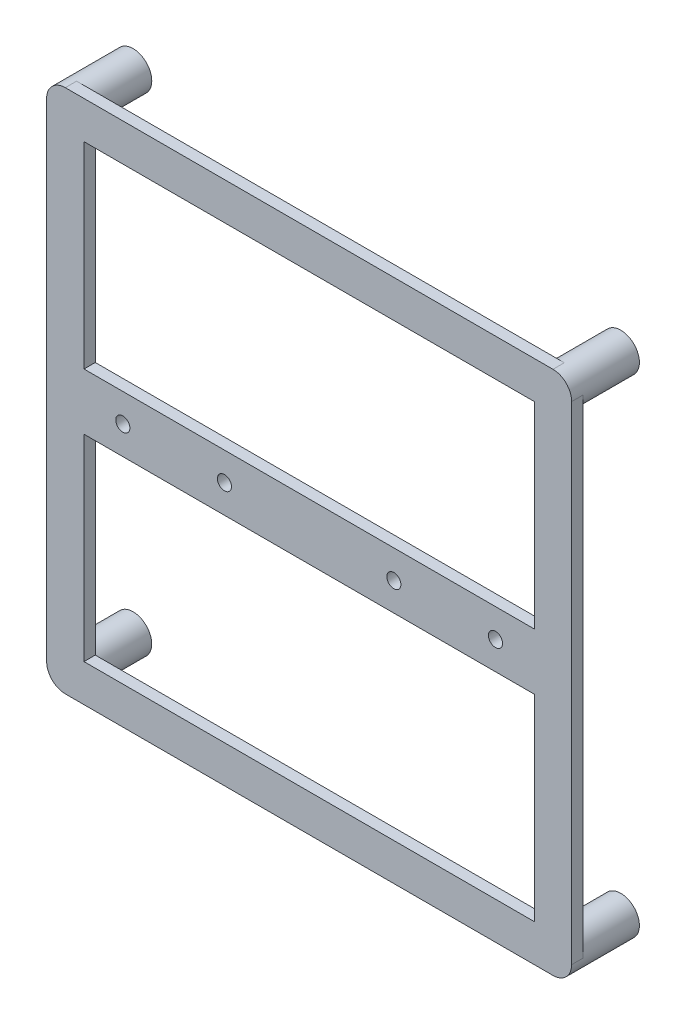
ISO-10303-21;
HEADER;
FILE_DESCRIPTION(('STEP AP214'),'2;1');
FILE_NAME('part.step','',(''),(''),'','','');
FILE_SCHEMA(('AUTOMOTIVE_DESIGN { 1 0 10303 214 1 1 1 1 }'));
ENDSEC;
DATA;
#1=APPLICATION_CONTEXT('core data for automotive mechanical design processes');
#2=APPLICATION_PROTOCOL_DEFINITION('international standard','automotive_design',2000,#1);
#3=PRODUCT_CONTEXT('',#1,'mechanical');
#4=PRODUCT('Part','Part','',(#3));
#5=PRODUCT_RELATED_PRODUCT_CATEGORY('part','',(#4));
#6=PRODUCT_DEFINITION_FORMATION('','',#4);
#7=PRODUCT_DEFINITION_CONTEXT('part definition',#1,'design');
#8=PRODUCT_DEFINITION('design','',#6,#7);
#9=PRODUCT_DEFINITION_SHAPE('','',#8);
#10=(LENGTH_UNIT() NAMED_UNIT(*) SI_UNIT(.MILLI.,.METRE.));
#11=(NAMED_UNIT(*) PLANE_ANGLE_UNIT() SI_UNIT($,.RADIAN.));
#12=(NAMED_UNIT(*) SI_UNIT($,.STERADIAN.) SOLID_ANGLE_UNIT());
#13=UNCERTAINTY_MEASURE_WITH_UNIT(LENGTH_MEASURE(1.E-05),#10,'distance_accuracy_value','');
#14=(GEOMETRIC_REPRESENTATION_CONTEXT(3) GLOBAL_UNCERTAINTY_ASSIGNED_CONTEXT((#13)) GLOBAL_UNIT_ASSIGNED_CONTEXT((#10,
#11,#12)) REPRESENTATION_CONTEXT('',''));
#15=CARTESIAN_POINT('',(0.,0.,0.));
#16=DIRECTION('',(0.,0.,1.));
#17=DIRECTION('',(1.,0.,0.));
#18=AXIS2_PLACEMENT_3D('',#15,#16,#17);
#19=CARTESIAN_POINT('',(0.,0.,10.));
#20=DIRECTION('',(0.,0.,1.));
#21=DIRECTION('',(1.,0.,0.));
#22=AXIS2_PLACEMENT_3D('',#19,#20,#21);
#23=PLANE('',#22);
#24=CARTESIAN_POINT('',(-33.,0.,10.));
#25=DIRECTION('',(0.,0.,1.));
#26=DIRECTION('',(1.,0.,0.));
#27=AXIS2_PLACEMENT_3D('',#24,#25,#26);
#28=CIRCLE('',#27,1.25);
#29=CARTESIAN_POINT('',(-31.75,0.,10.));
#30=VERTEX_POINT('',#29);
#31=EDGE_CURVE('E431',#30,#30,#28,.T.);
#32=ORIENTED_EDGE('',*,*,#31,.T.);
#33=EDGE_LOOP('',(#32));
#34=FACE_BOUND('',#33,.T.);
#35=CARTESIAN_POINT('',(-15.,0.,10.));
#36=DIRECTION('',(0.,0.,1.));
#37=DIRECTION('',(1.,0.,0.));
#38=AXIS2_PLACEMENT_3D('',#35,#36,#37);
#39=CIRCLE('',#38,1.25);
#40=CARTESIAN_POINT('',(-13.75,0.,10.));
#41=VERTEX_POINT('',#40);
#42=EDGE_CURVE('E437',#41,#41,#39,.T.);
#43=ORIENTED_EDGE('',*,*,#42,.T.);
#44=EDGE_LOOP('',(#43));
#45=FACE_BOUND('',#44,.T.);
#46=DIRECTION('',(1.,0.,0.));
#47=VECTOR('',#46,1.);
#48=CARTESIAN_POINT('',(0.,4.99981292793447,10.));
#49=LINE('',#48,#47);
#50=CARTESIAN_POINT('',(-39.8725578335857,4.99981292793447,10.));
#51=VERTEX_POINT('',#50);
#52=CARTESIAN_POINT('',(39.878,4.99981292793447,10.));
#53=VERTEX_POINT('',#52);
#54=EDGE_CURVE('E216',#51,#53,#49,.T.);
#55=ORIENTED_EDGE('',*,*,#54,.T.);
#56=DIRECTION('',(0.,1.,0.));
#57=VECTOR('',#56,1.);
#58=CARTESIAN_POINT('',(39.878,0.,10.));
#59=LINE('',#58,#57);
#60=CARTESIAN_POINT('',(39.878,39.8776270215178,10.));
#61=VERTEX_POINT('',#60);
#62=EDGE_CURVE('E217',#53,#61,#59,.T.);
#63=ORIENTED_EDGE('',*,*,#62,.T.);
#64=DIRECTION('',(-0.999999993620547,-0.000112955324001387,0.));
#65=VECTOR('',#64,1.);
#66=CARTESIAN_POINT('',(-0.00450388145226409,39.8731220803411,10.));
#67=LINE('',#66,#65);
#68=CARTESIAN_POINT('',(-39.8686192162487,39.8686192162487,10.));
#69=VERTEX_POINT('',#68);
#70=EDGE_CURVE('E219',#61,#69,#67,.T.);
#71=ORIENTED_EDGE('',*,*,#70,.T.);
#72=DIRECTION('',(-0.000112955324001458,-0.999999993620547,0.));
#73=VECTOR('',#72,1.);
#74=CARTESIAN_POINT('',(-39.8731220803411,0.00450388145226693,10.));
#75=LINE('',#74,#73);
#76=EDGE_CURVE('E164',#69,#51,#75,.T.);
#77=ORIENTED_EDGE('',*,*,#76,.T.);
#78=EDGE_LOOP('',(#55,#63,#71,#77));
#79=FACE_BOUND('',#78,.T.);
#80=DIRECTION('',(1.,0.,0.));
#81=VECTOR('',#80,1.);
#82=CARTESIAN_POINT('',(0.,-39.878,10.));
#83=LINE('',#82,#81);
#84=CARTESIAN_POINT('',(-39.8776270215178,-39.878,10.));
#85=VERTEX_POINT('',#84);
#86=CARTESIAN_POINT('',(39.878,-39.878,10.));
#87=VERTEX_POINT('',#86);
#88=EDGE_CURVE('E204',#85,#87,#83,.T.);
#89=ORIENTED_EDGE('',*,*,#88,.T.);
#90=CARTESIAN_POINT('',(39.878,-5.000187008271,10.));
#91=VERTEX_POINT('',#90);
#92=EDGE_CURVE('E213',#87,#91,#59,.T.);
#93=ORIENTED_EDGE('',*,*,#92,.T.);
#94=DIRECTION('',(1.,0.,0.));
#95=VECTOR('',#94,1.);
#96=CARTESIAN_POINT('',(0.,-5.000187008271,10.));
#97=LINE('',#96,#95);
#98=CARTESIAN_POINT('',(-39.8736873868257,-5.000187008271,10.));
#99=VERTEX_POINT('',#98);
#100=EDGE_CURVE('E210',#99,#91,#97,.T.);
#101=ORIENTED_EDGE('',*,*,#100,.F.);
#102=EDGE_CURVE('E207',#99,#85,#75,.T.);
#103=ORIENTED_EDGE('',*,*,#102,.T.);
#104=EDGE_LOOP('',(#89,#93,#101,#103));
#105=FACE_BOUND('',#104,.T.);
#106=CARTESIAN_POINT('',(43.18,43.18,10.));
#107=DIRECTION('',(0.,0.,1.));
#108=DIRECTION('',(1.,0.,0.));
#109=AXIS2_PLACEMENT_3D('',#106,#107,#108);
#110=CIRCLE('',#109,3.30200000000001);
#111=CARTESIAN_POINT('',(46.482,43.18,10.));
#112=VERTEX_POINT('',#111);
#113=CARTESIAN_POINT('',(43.18,46.482,10.));
#114=VERTEX_POINT('',#113);
#115=EDGE_CURVE('E11',#112,#114,#110,.F.);
#116=ORIENTED_EDGE('',*,*,#115,.F.);
#117=DIRECTION('',(0.,1.,0.));
#118=VECTOR('',#117,1.);
#119=CARTESIAN_POINT('',(46.482,0.,10.));
#120=LINE('',#119,#118);
#121=CARTESIAN_POINT('',(46.482,-43.18,10.));
#122=VERTEX_POINT('',#121);
#123=EDGE_CURVE('E193',#122,#112,#120,.T.);
#124=ORIENTED_EDGE('',*,*,#123,.F.);
#125=CARTESIAN_POINT('',(43.18,-43.18,10.));
#126=DIRECTION('',(0.,0.,1.));
#127=DIRECTION('',(1.,0.,0.));
#128=AXIS2_PLACEMENT_3D('',#125,#126,#127);
#129=CIRCLE('',#128,3.30200000000001);
#130=CARTESIAN_POINT('',(43.18,-46.482,10.));
#131=VERTEX_POINT('',#130);
#132=EDGE_CURVE('E343',#122,#131,#129,.T.);
#133=ORIENTED_EDGE('',*,*,#132,.T.);
#134=DIRECTION('',(1.,0.,0.));
#135=VECTOR('',#134,1.);
#136=CARTESIAN_POINT('',(0.,-46.482,10.));
#137=LINE('',#136,#135);
#138=CARTESIAN_POINT('',(-43.18,-46.482,10.));
#139=VERTEX_POINT('',#138);
#140=EDGE_CURVE('E190',#139,#131,#137,.T.);
#141=ORIENTED_EDGE('',*,*,#140,.F.);
#142=CARTESIAN_POINT('',(-43.18,-43.18,10.));
#143=DIRECTION('',(0.,0.,1.));
#144=DIRECTION('',(1.,0.,0.));
#145=AXIS2_PLACEMENT_3D('',#142,#143,#144);
#146=CIRCLE('',#145,3.302);
#147=CARTESIAN_POINT('',(-46.482,-43.18,10.));
#148=VERTEX_POINT('',#147);
#149=EDGE_CURVE('E49',#148,#139,#146,.F.);
#150=ORIENTED_EDGE('',*,*,#149,.F.);
#151=DIRECTION('',(0.000112955324001467,-0.999999993620547,0.));
#152=VECTOR('',#151,1.);
#153=CARTESIAN_POINT('',(-46.4868768177998,-0.005250940266269,10.));
#154=LINE('',#153,#152);
#155=CARTESIAN_POINT('',(-46.4917547795886,43.1796259196635,10.));
#156=VERTEX_POINT('',#155);
#157=EDGE_CURVE('E200',#156,#148,#154,.T.);
#158=ORIENTED_EDGE('',*,*,#157,.F.);
#159=CARTESIAN_POINT('',(-43.18,43.18,10.));
#160=DIRECTION('',(0.,0.,1.));
#161=DIRECTION('',(1.,0.,0.));
#162=AXIS2_PLACEMENT_3D('',#159,#160,#161);
#163=CIRCLE('',#162,3.311754821843);
#164=CARTESIAN_POINT('',(-43.1796259196623,46.4917547901522,10.));
#165=VERTEX_POINT('',#164);
#166=EDGE_CURVE('E58',#156,#165,#163,.T.);
#167=ORIENTED_EDGE('',*,*,#166,.T.);
#168=DIRECTION('',(-0.999999993620547,0.000112955324001387,0.));
#169=VECTOR('',#168,1.);
#170=CARTESIAN_POINT('',(0.00525094026626527,46.4868768177998,10.));
#171=LINE('',#170,#169);
#172=EDGE_CURVE('E197',#114,#165,#171,.T.);
#173=ORIENTED_EDGE('',*,*,#172,.F.);
#174=EDGE_LOOP('',(#116,#124,#133,#141,#150,#158,#167,#173));
#175=FACE_BOUND('',#174,.T.);
#176=CARTESIAN_POINT('',(32.9999804512073,-0.0359196316075853,10.));
#177=DIRECTION('',(0.,0.,1.));
#178=DIRECTION('',(1.,0.,0.));
#179=AXIS2_PLACEMENT_3D('',#176,#177,#178);
#180=CIRCLE('',#179,1.25);
#181=CARTESIAN_POINT('',(34.2499804512073,-0.0359196316075853,10.));
#182=VERTEX_POINT('',#181);
#183=EDGE_CURVE('E450',#182,#182,#180,.F.);
#184=ORIENTED_EDGE('',*,*,#183,.F.);
#185=EDGE_LOOP('',(#184));
#186=FACE_BOUND('',#185,.T.);
#187=CARTESIAN_POINT('',(14.9999911141851,-0.0163271052761751,10.));
#188=DIRECTION('',(0.,0.,1.));
#189=DIRECTION('',(1.,0.,0.));
#190=AXIS2_PLACEMENT_3D('',#187,#188,#189);
#191=CIRCLE('',#190,1.25);
#192=CARTESIAN_POINT('',(16.2499911141851,-0.0163271052761751,10.));
#193=VERTEX_POINT('',#192);
#194=EDGE_CURVE('E440',#193,#193,#191,.F.);
#195=ORIENTED_EDGE('',*,*,#194,.F.);
#196=EDGE_LOOP('',(#195));
#197=FACE_BOUND('',#196,.T.);
#198=ADVANCED_FACE('F41',(#34,#45,#79,#105,#175,#186,#197),#23,.F.);
#199=CARTESIAN_POINT('',(0.,0.,12.));
#200=DIRECTION('',(0.,0.,1.));
#201=DIRECTION('',(1.,0.,0.));
#202=AXIS2_PLACEMENT_3D('',#199,#200,#201);
#203=PLANE('',#202);
#204=CARTESIAN_POINT('',(-33.,0.,12.));
#205=DIRECTION('',(0.,0.,1.));
#206=DIRECTION('',(1.,0.,0.));
#207=AXIS2_PLACEMENT_3D('',#204,#205,#206);
#208=CIRCLE('',#207,1.25);
#209=CARTESIAN_POINT('',(-31.75,0.,12.));
#210=VERTEX_POINT('',#209);
#211=EDGE_CURVE('E433',#210,#210,#208,.T.);
#212=ORIENTED_EDGE('',*,*,#211,.F.);
#213=EDGE_LOOP('',(#212));
#214=FACE_BOUND('',#213,.T.);
#215=CARTESIAN_POINT('',(32.9999804512073,-0.0359196316075853,12.));
#216=DIRECTION('',(0.,0.,1.));
#217=DIRECTION('',(1.,0.,0.));
#218=AXIS2_PLACEMENT_3D('',#215,#216,#217);
#219=CIRCLE('',#218,1.25);
#220=CARTESIAN_POINT('',(34.2499804512073,-0.0359196316075853,12.));
#221=VERTEX_POINT('',#220);
#222=EDGE_CURVE('E428',#221,#221,#219,.F.);
#223=ORIENTED_EDGE('',*,*,#222,.T.);
#224=EDGE_LOOP('',(#223));
#225=FACE_BOUND('',#224,.T.);
#226=CARTESIAN_POINT('',(-15.,0.,12.));
#227=DIRECTION('',(0.,0.,1.));
#228=DIRECTION('',(1.,0.,0.));
#229=AXIS2_PLACEMENT_3D('',#226,#227,#228);
#230=CIRCLE('',#229,1.25);
#231=CARTESIAN_POINT('',(-13.75,0.,12.));
#232=VERTEX_POINT('',#231);
#233=EDGE_CURVE('E448',#232,#232,#230,.T.);
#234=ORIENTED_EDGE('',*,*,#233,.F.);
#235=EDGE_LOOP('',(#234));
#236=FACE_BOUND('',#235,.T.);
#237=CARTESIAN_POINT('',(-43.18,-43.18,12.));
#238=DIRECTION('',(0.,0.,1.));
#239=DIRECTION('',(1.,0.,0.));
#240=AXIS2_PLACEMENT_3D('',#237,#238,#239);
#241=CIRCLE('',#240,3.302);
#242=CARTESIAN_POINT('',(-46.482,-43.18,12.));
#243=VERTEX_POINT('',#242);
#244=CARTESIAN_POINT('',(-43.18,-46.482,12.));
#245=VERTEX_POINT('',#244);
#246=EDGE_CURVE('E312',#243,#245,#241,.T.);
#247=ORIENTED_EDGE('',*,*,#246,.T.);
#248=DIRECTION('',(1.,0.,0.));
#249=VECTOR('',#248,1.);
#250=CARTESIAN_POINT('',(0.,-46.482,12.));
#251=LINE('',#250,#249);
#252=CARTESIAN_POINT('',(43.18,-46.482,12.));
#253=VERTEX_POINT('',#252);
#254=EDGE_CURVE('E117',#245,#253,#251,.T.);
#255=ORIENTED_EDGE('',*,*,#254,.T.);
#256=CARTESIAN_POINT('',(43.18,-43.18,12.));
#257=DIRECTION('',(0.,0.,1.));
#258=DIRECTION('',(1.,0.,0.));
#259=AXIS2_PLACEMENT_3D('',#256,#257,#258);
#260=CIRCLE('',#259,3.30200000000001);
#261=CARTESIAN_POINT('',(46.482,-43.18,12.));
#262=VERTEX_POINT('',#261);
#263=EDGE_CURVE('E314',#253,#262,#260,.T.);
#264=ORIENTED_EDGE('',*,*,#263,.T.);
#265=DIRECTION('',(0.,1.,0.));
#266=VECTOR('',#265,1.);
#267=CARTESIAN_POINT('',(46.482,0.,12.));
#268=LINE('',#267,#266);
#269=CARTESIAN_POINT('',(46.482,43.18,12.));
#270=VERTEX_POINT('',#269);
#271=EDGE_CURVE('E321',#262,#270,#268,.T.);
#272=ORIENTED_EDGE('',*,*,#271,.T.);
#273=CARTESIAN_POINT('',(43.18,43.18,12.));
#274=DIRECTION('',(0.,0.,1.));
#275=DIRECTION('',(1.,0.,0.));
#276=AXIS2_PLACEMENT_3D('',#273,#274,#275);
#277=CIRCLE('',#276,3.30200000000001);
#278=CARTESIAN_POINT('',(43.18,46.482,12.));
#279=VERTEX_POINT('',#278);
#280=EDGE_CURVE('E295',#270,#279,#277,.T.);
#281=ORIENTED_EDGE('',*,*,#280,.T.);
#282=DIRECTION('',(-0.999999993620547,0.000112955324001387,0.));
#283=VECTOR('',#282,1.);
#284=CARTESIAN_POINT('',(0.00525094026626527,46.4868768177998,12.));
#285=LINE('',#284,#283);
#286=CARTESIAN_POINT('',(-43.1796259196623,46.4917547901522,12.));
#287=VERTEX_POINT('',#286);
#288=EDGE_CURVE('E290',#279,#287,#285,.T.);
#289=ORIENTED_EDGE('',*,*,#288,.T.);
#290=CARTESIAN_POINT('',(-43.18,43.18,12.));
#291=DIRECTION('',(0.,0.,1.));
#292=DIRECTION('',(1.,0.,0.));
#293=AXIS2_PLACEMENT_3D('',#290,#291,#292);
#294=CIRCLE('',#293,3.311754821843);
#295=CARTESIAN_POINT('',(-46.4917547901522,43.1796259196623,12.));
#296=VERTEX_POINT('',#295);
#297=EDGE_CURVE('E286',#287,#296,#294,.T.);
#298=ORIENTED_EDGE('',*,*,#297,.T.);
#299=DIRECTION('',(0.000112955324001467,-0.999999993620547,0.));
#300=VECTOR('',#299,1.);
#301=CARTESIAN_POINT('',(-46.4868768177998,-0.005250940266269,12.));
#302=LINE('',#301,#300);
#303=EDGE_CURVE('E282',#296,#243,#302,.T.);
#304=ORIENTED_EDGE('',*,*,#303,.T.);
#305=EDGE_LOOP('',(#247,#255,#264,#272,#281,#289,#298,#304));
#306=FACE_BOUND('',#305,.T.);
#307=DIRECTION('',(1.,0.,0.));
#308=VECTOR('',#307,1.);
#309=CARTESIAN_POINT('',(0.,-39.878,12.));
#310=LINE('',#309,#308);
#311=CARTESIAN_POINT('',(-39.8776270215178,-39.878,12.));
#312=VERTEX_POINT('',#311);
#313=CARTESIAN_POINT('',(39.878,-39.878,12.));
#314=VERTEX_POINT('',#313);
#315=EDGE_CURVE('E293',#312,#314,#310,.T.);
#316=ORIENTED_EDGE('',*,*,#315,.F.);
#317=DIRECTION('',(-0.000112955324001458,-0.999999993620547,0.));
#318=VECTOR('',#317,1.);
#319=CARTESIAN_POINT('',(-39.8731220803411,0.00450388145226693,12.));
#320=LINE('',#319,#318);
#321=CARTESIAN_POINT('',(-39.8736873868257,-5.000187008271,12.));
#322=VERTEX_POINT('',#321);
#323=EDGE_CURVE('E181',#322,#312,#320,.T.);
#324=ORIENTED_EDGE('',*,*,#323,.F.);
#325=DIRECTION('',(1.,0.,0.));
#326=VECTOR('',#325,1.);
#327=CARTESIAN_POINT('',(0.,-5.000187008271,12.));
#328=LINE('',#327,#326);
#329=CARTESIAN_POINT('',(39.878,-5.000187008271,12.));
#330=VERTEX_POINT('',#329);
#331=EDGE_CURVE('E303',#322,#330,#328,.T.);
#332=ORIENTED_EDGE('',*,*,#331,.T.);
#333=DIRECTION('',(0.,1.,0.));
#334=VECTOR('',#333,1.);
#335=CARTESIAN_POINT('',(39.878,0.,12.));
#336=LINE('',#335,#334);
#337=EDGE_CURVE('E187',#314,#330,#336,.T.);
#338=ORIENTED_EDGE('',*,*,#337,.F.);
#339=EDGE_LOOP('',(#316,#324,#332,#338));
#340=FACE_BOUND('',#339,.T.);
#341=DIRECTION('',(1.,0.,0.));
#342=VECTOR('',#341,1.);
#343=CARTESIAN_POINT('',(0.,4.99981292793447,12.));
#344=LINE('',#343,#342);
#345=CARTESIAN_POINT('',(-39.8725578335857,4.99981292793447,12.));
#346=VERTEX_POINT('',#345);
#347=CARTESIAN_POINT('',(39.878,4.99981292793447,12.));
#348=VERTEX_POINT('',#347);
#349=EDGE_CURVE('E179',#346,#348,#344,.T.);
#350=ORIENTED_EDGE('',*,*,#349,.F.);
#351=CARTESIAN_POINT('',(-39.8686192162487,39.8686192162487,12.));
#352=VERTEX_POINT('',#351);
#353=EDGE_CURVE('E162',#352,#346,#320,.T.);
#354=ORIENTED_EDGE('',*,*,#353,.F.);
#355=DIRECTION('',(-0.999999993620547,-0.000112955324001387,0.));
#356=VECTOR('',#355,1.);
#357=CARTESIAN_POINT('',(-0.00450388145226409,39.8731220803411,12.));
#358=LINE('',#357,#356);
#359=CARTESIAN_POINT('',(39.878,39.8776270215178,12.));
#360=VERTEX_POINT('',#359);
#361=EDGE_CURVE('E178',#360,#352,#358,.T.);
#362=ORIENTED_EDGE('',*,*,#361,.F.);
#363=EDGE_CURVE('E183',#348,#360,#336,.T.);
#364=ORIENTED_EDGE('',*,*,#363,.F.);
#365=EDGE_LOOP('',(#350,#354,#362,#364));
#366=FACE_BOUND('',#365,.T.);
#367=CARTESIAN_POINT('',(14.9999911141851,-0.0163271052761751,12.));
#368=DIRECTION('',(0.,0.,1.));
#369=DIRECTION('',(1.,0.,0.));
#370=AXIS2_PLACEMENT_3D('',#367,#368,#369);
#371=CIRCLE('',#370,1.25);
#372=CARTESIAN_POINT('',(16.2499911141851,-0.0163271052761751,12.));
#373=VERTEX_POINT('',#372);
#374=EDGE_CURVE('E443',#373,#373,#371,.F.);
#375=ORIENTED_EDGE('',*,*,#374,.T.);
#376=EDGE_LOOP('',(#375));
#377=FACE_BOUND('',#376,.T.);
#378=ADVANCED_FACE('F175',(#214,#225,#236,#306,#340,#366,#377),#203,.T.);
#379=CARTESIAN_POINT('',(-43.18,43.18,10.));
#380=DIRECTION('',(0.,0.,-1.));
#381=DIRECTION('',(-1.,0.,0.));
#382=AXIS2_PLACEMENT_3D('',#379,#380,#381);
#383=CYLINDRICAL_SURFACE('',#382,1.25);
#384=CARTESIAN_POINT('',(-43.18,43.18,10.));
#385=DIRECTION('',(0.,0.,1.));
#386=DIRECTION('',(1.,0.,0.));
#387=AXIS2_PLACEMENT_3D('',#384,#385,#386);
#388=CIRCLE('',#387,1.25);
#389=CARTESIAN_POINT('',(-41.93,43.18,10.));
#390=VERTEX_POINT('',#389);
#391=EDGE_CURVE('E225',#390,#390,#388,.T.);
#392=ORIENTED_EDGE('',*,*,#391,.T.);
#393=EDGE_LOOP('',(#392));
#394=FACE_BOUND('',#393,.T.);
#395=CARTESIAN_POINT('',(-43.18,43.18,0.));
#396=DIRECTION('',(0.,0.,1.));
#397=DIRECTION('',(1.,0.,0.));
#398=AXIS2_PLACEMENT_3D('',#395,#396,#397);
#399=CIRCLE('',#398,1.25);
#400=CARTESIAN_POINT('',(-41.93,43.18,0.));
#401=VERTEX_POINT('',#400);
#402=EDGE_CURVE('E257',#401,#401,#399,.T.);
#403=ORIENTED_EDGE('',*,*,#402,.F.);
#404=EDGE_LOOP('',(#403));
#405=FACE_BOUND('',#404,.T.);
#406=ADVANCED_FACE('F43',(#394,#405),#383,.F.);
#407=CARTESIAN_POINT('',(-43.18,43.18,10.));
#408=DIRECTION('',(0.,0.,-1.));
#409=DIRECTION('',(-1.,0.,0.));
#410=AXIS2_PLACEMENT_3D('',#407,#408,#409);
#411=CYLINDRICAL_SURFACE('',#410,3.311754821843);
#412=ORIENTED_EDGE('',*,*,#166,.F.);
#413=DIRECTION('',(0.,0.,-1.));
#414=VECTOR('',#413,1.);
#415=CARTESIAN_POINT('',(-46.4917547901522,43.1796259196623,12.));
#416=LINE('',#415,#414);
#417=EDGE_CURVE('E236',#296,#156,#416,.T.);
#418=ORIENTED_EDGE('',*,*,#417,.F.);
#419=ORIENTED_EDGE('',*,*,#297,.F.);
#420=DIRECTION('',(0.,0.,-1.));
#421=VECTOR('',#420,1.);
#422=CARTESIAN_POINT('',(-43.1796259196623,46.4917547901522,12.));
#423=LINE('',#422,#421);
#424=EDGE_CURVE('E239',#287,#165,#423,.T.);
#425=ORIENTED_EDGE('',*,*,#424,.T.);
#426=EDGE_LOOP('',(#412,#418,#419,#425));
#427=FACE_BOUND('',#426,.T.);
#428=CARTESIAN_POINT('',(-43.18,43.18,0.));
#429=DIRECTION('',(0.,0.,1.));
#430=DIRECTION('',(1.,0.,0.));
#431=AXIS2_PLACEMENT_3D('',#428,#429,#430);
#432=CIRCLE('',#431,3.311754821843);
#433=CARTESIAN_POINT('',(-39.868245178157,43.18,0.));
#434=VERTEX_POINT('',#433);
#435=EDGE_CURVE('E260',#434,#434,#432,.T.);
#436=ORIENTED_EDGE('',*,*,#435,.T.);
#437=EDGE_LOOP('',(#436));
#438=FACE_BOUND('',#437,.T.);
#439=ADVANCED_FACE('F284',(#427,#438),#411,.T.);
#440=CARTESIAN_POINT('',(0.,0.,0.));
#441=DIRECTION('',(0.,0.,1.));
#442=DIRECTION('',(1.,0.,0.));
#443=AXIS2_PLACEMENT_3D('',#440,#441,#442);
#444=PLANE('',#443);
#445=ORIENTED_EDGE('',*,*,#402,.T.);
#446=EDGE_LOOP('',(#445));
#447=FACE_BOUND('',#446,.T.);
#448=ORIENTED_EDGE('',*,*,#435,.F.);
#449=EDGE_LOOP('',(#448));
#450=FACE_BOUND('',#449,.T.);
#451=ADVANCED_FACE('F496',(#447,#450),#444,.F.);
#452=CARTESIAN_POINT('',(39.878,0.,12.));
#453=DIRECTION('',(-1.,0.,0.));
#454=DIRECTION('',(0.,0.,1.));
#455=AXIS2_PLACEMENT_3D('',#452,#453,#454);
#456=PLANE('',#455);
#457=ORIENTED_EDGE('',*,*,#62,.F.);
#458=DIRECTION('',(0.,0.,-1.));
#459=VECTOR('',#458,1.);
#460=CARTESIAN_POINT('',(39.878,4.99981292793447,12.));
#461=LINE('',#460,#459);
#462=EDGE_CURVE('E67',#348,#53,#461,.T.);
#463=ORIENTED_EDGE('',*,*,#462,.F.);
#464=ORIENTED_EDGE('',*,*,#363,.T.);
#465=DIRECTION('',(0.,0.,-1.));
#466=VECTOR('',#465,1.);
#467=CARTESIAN_POINT('',(39.878,39.8776270215178,12.));
#468=LINE('',#467,#466);
#469=EDGE_CURVE('E170',#360,#61,#468,.T.);
#470=ORIENTED_EDGE('',*,*,#469,.T.);
#471=EDGE_LOOP('',(#457,#463,#464,#470));
#472=FACE_BOUND('',#471,.T.);
#473=ADVANCED_FACE('F308',(#472),#456,.T.);
#474=CARTESIAN_POINT('',(-46.4868768177998,-0.005250940266269,12.));
#475=DIRECTION('',(0.999999993620547,0.000112955324001467,0.));
#476=DIRECTION('',(-0.000112955324001467,0.999999993620547,0.));
#477=AXIS2_PLACEMENT_3D('',#474,#475,#476);
#478=PLANE('',#477);
#479=ORIENTED_EDGE('',*,*,#157,.T.);
#480=DIRECTION('',(0.,0.,-1.));
#481=VECTOR('',#480,1.);
#482=CARTESIAN_POINT('',(-46.482,-43.18,12.));
#483=LINE('',#482,#481);
#484=EDGE_CURVE('E185',#243,#148,#483,.T.);
#485=ORIENTED_EDGE('',*,*,#484,.F.);
#486=ORIENTED_EDGE('',*,*,#303,.F.);
#487=ORIENTED_EDGE('',*,*,#417,.T.);
#488=EDGE_LOOP('',(#479,#485,#486,#487));
#489=FACE_BOUND('',#488,.T.);
#490=ADVANCED_FACE('F280',(#489),#478,.F.);
#491=ORIENTED_EDGE('',*,*,#92,.F.);
#492=DIRECTION('',(0.,0.,-1.));
#493=VECTOR('',#492,1.);
#494=CARTESIAN_POINT('',(39.878,-39.878,12.));
#495=LINE('',#494,#493);
#496=EDGE_CURVE('E226',#314,#87,#495,.T.);
#497=ORIENTED_EDGE('',*,*,#496,.F.);
#498=ORIENTED_EDGE('',*,*,#337,.T.);
#499=DIRECTION('',(0.,0.,-1.));
#500=VECTOR('',#499,1.);
#501=CARTESIAN_POINT('',(39.878,-5.000187008271,12.));
#502=LINE('',#501,#500);
#503=EDGE_CURVE('E228',#330,#91,#502,.T.);
#504=ORIENTED_EDGE('',*,*,#503,.T.);
#505=EDGE_LOOP('',(#491,#497,#498,#504));
#506=FACE_BOUND('',#505,.T.);
#507=ADVANCED_FACE('F533',(#506),#456,.T.);
#508=CARTESIAN_POINT('',(0.00525094026626527,46.4868768177998,12.));
#509=DIRECTION('',(-0.000112955324001387,-0.999999993620547,0.));
#510=DIRECTION('',(0.999999993620547,-0.000112955324001387,0.));
#511=AXIS2_PLACEMENT_3D('',#508,#509,#510);
#512=PLANE('',#511);
#513=ORIENTED_EDGE('',*,*,#172,.T.);
#514=ORIENTED_EDGE('',*,*,#424,.F.);
#515=ORIENTED_EDGE('',*,*,#288,.F.);
#516=DIRECTION('',(0.,0.,-1.));
#517=VECTOR('',#516,1.);
#518=CARTESIAN_POINT('',(43.18,46.482,12.));
#519=LINE('',#518,#517);
#520=EDGE_CURVE('E241',#279,#114,#519,.T.);
#521=ORIENTED_EDGE('',*,*,#520,.T.);
#522=EDGE_LOOP('',(#513,#514,#515,#521));
#523=FACE_BOUND('',#522,.T.);
#524=ADVANCED_FACE('F333',(#523),#512,.F.);
#525=CARTESIAN_POINT('',(43.18,43.18,12.));
#526=DIRECTION('',(0.,0.,-1.));
#527=DIRECTION('',(-1.,0.,0.));
#528=AXIS2_PLACEMENT_3D('',#525,#526,#527);
#529=CYLINDRICAL_SURFACE('',#528,3.30200000000001);
#530=DIRECTION('',(0.,0.,-1.));
#531=VECTOR('',#530,1.);
#532=CARTESIAN_POINT('',(46.482,43.18,12.));
#533=LINE('',#532,#531);
#534=EDGE_CURVE('E244',#270,#112,#533,.T.);
#535=ORIENTED_EDGE('',*,*,#534,.T.);
#536=ORIENTED_EDGE('',*,*,#115,.T.);
#537=ORIENTED_EDGE('',*,*,#520,.F.);
#538=ORIENTED_EDGE('',*,*,#280,.F.);
#539=EDGE_LOOP('',(#535,#536,#537,#538));
#540=FACE_BOUND('',#539,.T.);
#541=CARTESIAN_POINT('',(43.18,43.18,0.));
#542=DIRECTION('',(0.,0.,1.));
#543=DIRECTION('',(1.,0.,0.));
#544=AXIS2_PLACEMENT_3D('',#541,#542,#543);
#545=CIRCLE('',#544,3.30200000000001);
#546=CARTESIAN_POINT('',(46.482,43.18,0.));
#547=VERTEX_POINT('',#546);
#548=EDGE_CURVE('E422',#547,#547,#545,.T.);
#549=ORIENTED_EDGE('',*,*,#548,.T.);
#550=EDGE_LOOP('',(#549));
#551=FACE_BOUND('',#550,.T.);
#552=ADVANCED_FACE('F329',(#540,#551),#529,.T.);
#553=CARTESIAN_POINT('',(46.482,0.,12.));
#554=DIRECTION('',(-1.,0.,0.));
#555=DIRECTION('',(0.,0.,1.));
#556=AXIS2_PLACEMENT_3D('',#553,#554,#555);
#557=PLANE('',#556);
#558=ORIENTED_EDGE('',*,*,#123,.T.);
#559=ORIENTED_EDGE('',*,*,#534,.F.);
#560=ORIENTED_EDGE('',*,*,#271,.F.);
#561=DIRECTION('',(0.,0.,-1.));
#562=VECTOR('',#561,1.);
#563=CARTESIAN_POINT('',(46.482,-43.18,12.));
#564=LINE('',#563,#562);
#565=EDGE_CURVE('E247',#262,#122,#564,.T.);
#566=ORIENTED_EDGE('',*,*,#565,.T.);
#567=EDGE_LOOP('',(#558,#559,#560,#566));
#568=FACE_BOUND('',#567,.T.);
#569=ADVANCED_FACE('F338',(#568),#557,.F.);
#570=CARTESIAN_POINT('',(43.18,-43.18,12.));
#571=DIRECTION('',(0.,0.,-1.));
#572=DIRECTION('',(-1.,0.,0.));
#573=AXIS2_PLACEMENT_3D('',#570,#571,#572);
#574=CYLINDRICAL_SURFACE('',#573,3.30200000000001);
#575=DIRECTION('',(0.,0.,-1.));
#576=VECTOR('',#575,1.);
#577=CARTESIAN_POINT('',(43.18,-46.482,12.));
#578=LINE('',#577,#576);
#579=EDGE_CURVE('E250',#253,#131,#578,.T.);
#580=ORIENTED_EDGE('',*,*,#579,.T.);
#581=ORIENTED_EDGE('',*,*,#132,.F.);
#582=ORIENTED_EDGE('',*,*,#565,.F.);
#583=ORIENTED_EDGE('',*,*,#263,.F.);
#584=EDGE_LOOP('',(#580,#581,#582,#583));
#585=FACE_BOUND('',#584,.T.);
#586=CARTESIAN_POINT('',(43.18,-43.18,0.));
#587=DIRECTION('',(0.,0.,1.));
#588=DIRECTION('',(1.,0.,0.));
#589=AXIS2_PLACEMENT_3D('',#586,#587,#588);
#590=CIRCLE('',#589,3.30200000000001);
#591=CARTESIAN_POINT('',(46.482,-43.18,0.));
#592=VERTEX_POINT('',#591);
#593=EDGE_CURVE('E351',#592,#592,#590,.T.);
#594=ORIENTED_EDGE('',*,*,#593,.T.);
#595=EDGE_LOOP('',(#594));
#596=FACE_BOUND('',#595,.T.);
#597=ADVANCED_FACE('F344',(#585,#596),#574,.T.);
#598=CARTESIAN_POINT('',(0.,-46.482,12.));
#599=DIRECTION('',(0.,1.,0.));
#600=DIRECTION('',(-1.,0.,0.));
#601=AXIS2_PLACEMENT_3D('',#598,#599,#600);
#602=PLANE('',#601);
#603=ORIENTED_EDGE('',*,*,#140,.T.);
#604=ORIENTED_EDGE('',*,*,#579,.F.);
#605=ORIENTED_EDGE('',*,*,#254,.F.);
#606=DIRECTION('',(0.,0.,-1.));
#607=VECTOR('',#606,1.);
#608=CARTESIAN_POINT('',(-43.18,-46.482,12.));
#609=LINE('',#608,#607);
#610=EDGE_CURVE('E229',#245,#139,#609,.T.);
#611=ORIENTED_EDGE('',*,*,#610,.T.);
#612=EDGE_LOOP('',(#603,#604,#605,#611));
#613=FACE_BOUND('',#612,.T.);
#614=ADVANCED_FACE('F483',(#613),#602,.F.);
#615=CARTESIAN_POINT('',(-43.18,-43.18,12.));
#616=DIRECTION('',(0.,0.,-1.));
#617=DIRECTION('',(-1.,0.,0.));
#618=AXIS2_PLACEMENT_3D('',#615,#616,#617);
#619=CYLINDRICAL_SURFACE('',#618,3.302);
#620=ORIENTED_EDGE('',*,*,#484,.T.);
#621=ORIENTED_EDGE('',*,*,#149,.T.);
#622=ORIENTED_EDGE('',*,*,#610,.F.);
#623=ORIENTED_EDGE('',*,*,#246,.F.);
#624=EDGE_LOOP('',(#620,#621,#622,#623));
#625=FACE_BOUND('',#624,.T.);
#626=CARTESIAN_POINT('',(-43.18,-43.18,0.));
#627=DIRECTION('',(0.,0.,1.));
#628=DIRECTION('',(1.,0.,0.));
#629=AXIS2_PLACEMENT_3D('',#626,#627,#628);
#630=CIRCLE('',#629,3.302);
#631=CARTESIAN_POINT('',(-39.878,-43.18,0.));
#632=VERTEX_POINT('',#631);
#633=EDGE_CURVE('E317',#632,#632,#630,.T.);
#634=ORIENTED_EDGE('',*,*,#633,.T.);
#635=EDGE_LOOP('',(#634));
#636=FACE_BOUND('',#635,.T.);
#637=ADVANCED_FACE('F269',(#625,#636),#619,.T.);
#638=CARTESIAN_POINT('',(0.,-5.000187008271,12.));
#639=DIRECTION('',(0.,1.,0.));
#640=DIRECTION('',(0.,0.,1.));
#641=AXIS2_PLACEMENT_3D('',#638,#639,#640);
#642=PLANE('',#641);
#643=ORIENTED_EDGE('',*,*,#100,.T.);
#644=ORIENTED_EDGE('',*,*,#503,.F.);
#645=ORIENTED_EDGE('',*,*,#331,.F.);
#646=DIRECTION('',(0.,0.,-1.));
#647=VECTOR('',#646,1.);
#648=CARTESIAN_POINT('',(-39.8736873868257,-5.000187008271,12.));
#649=LINE('',#648,#647);
#650=EDGE_CURVE('E231',#322,#99,#649,.T.);
#651=ORIENTED_EDGE('',*,*,#650,.T.);
#652=EDGE_LOOP('',(#643,#644,#645,#651));
#653=FACE_BOUND('',#652,.T.);
#654=ADVANCED_FACE('F495',(#653),#642,.F.);
#655=CARTESIAN_POINT('',(-39.8731220803411,0.00450388145226693,12.));
#656=DIRECTION('',(0.999999993620547,-0.000112955324001458,0.));
#657=DIRECTION('',(0.000112955324001458,0.999999993620547,0.));
#658=AXIS2_PLACEMENT_3D('',#655,#656,#657);
#659=PLANE('',#658);
#660=ORIENTED_EDGE('',*,*,#102,.F.);
#661=ORIENTED_EDGE('',*,*,#650,.F.);
#662=ORIENTED_EDGE('',*,*,#323,.T.);
#663=DIRECTION('',(0.,0.,-1.));
#664=VECTOR('',#663,1.);
#665=CARTESIAN_POINT('',(-39.8776270215178,-39.878,12.));
#666=LINE('',#665,#664);
#667=EDGE_CURVE('E222',#312,#85,#666,.T.);
#668=ORIENTED_EDGE('',*,*,#667,.T.);
#669=EDGE_LOOP('',(#660,#661,#662,#668));
#670=FACE_BOUND('',#669,.T.);
#671=ADVANCED_FACE('F586',(#670),#659,.T.);
#672=CARTESIAN_POINT('',(0.,-39.878,12.));
#673=DIRECTION('',(0.,1.,0.));
#674=DIRECTION('',(-1.,0.,0.));
#675=AXIS2_PLACEMENT_3D('',#672,#673,#674);
#676=PLANE('',#675);
#677=ORIENTED_EDGE('',*,*,#88,.F.);
#678=ORIENTED_EDGE('',*,*,#667,.F.);
#679=ORIENTED_EDGE('',*,*,#315,.T.);
#680=ORIENTED_EDGE('',*,*,#496,.T.);
#681=EDGE_LOOP('',(#677,#678,#679,#680));
#682=FACE_BOUND('',#681,.T.);
#683=ADVANCED_FACE('F597',(#682),#676,.T.);
#684=CARTESIAN_POINT('',(-0.00450388145226409,39.8731220803411,12.));
#685=DIRECTION('',(0.000112955324001387,-0.999999993620547,0.));
#686=DIRECTION('',(0.999999993620547,0.000112955324001387,0.));
#687=AXIS2_PLACEMENT_3D('',#684,#685,#686);
#688=PLANE('',#687);
#689=ORIENTED_EDGE('',*,*,#70,.F.);
#690=ORIENTED_EDGE('',*,*,#469,.F.);
#691=ORIENTED_EDGE('',*,*,#361,.T.);
#692=DIRECTION('',(0.,0.,-1.));
#693=VECTOR('',#692,1.);
#694=CARTESIAN_POINT('',(-39.8686192162487,39.8686192162487,12.));
#695=LINE('',#694,#693);
#696=EDGE_CURVE('E159',#352,#69,#695,.T.);
#697=ORIENTED_EDGE('',*,*,#696,.T.);
#698=EDGE_LOOP('',(#689,#690,#691,#697));
#699=FACE_BOUND('',#698,.T.);
#700=ADVANCED_FACE('F182',(#699),#688,.T.);
#701=ORIENTED_EDGE('',*,*,#76,.F.);
#702=ORIENTED_EDGE('',*,*,#696,.F.);
#703=ORIENTED_EDGE('',*,*,#353,.T.);
#704=DIRECTION('',(0.,0.,-1.));
#705=VECTOR('',#704,1.);
#706=CARTESIAN_POINT('',(-39.8725578335857,4.99981292793447,12.));
#707=LINE('',#706,#705);
#708=EDGE_CURVE('E169',#346,#51,#707,.T.);
#709=ORIENTED_EDGE('',*,*,#708,.T.);
#710=EDGE_LOOP('',(#701,#702,#703,#709));
#711=FACE_BOUND('',#710,.T.);
#712=ADVANCED_FACE('F161',(#711),#659,.T.);
#713=CARTESIAN_POINT('',(0.,4.99981292793447,12.));
#714=DIRECTION('',(0.,1.,0.));
#715=DIRECTION('',(0.,0.,1.));
#716=AXIS2_PLACEMENT_3D('',#713,#714,#715);
#717=PLANE('',#716);
#718=ORIENTED_EDGE('',*,*,#54,.F.);
#719=ORIENTED_EDGE('',*,*,#708,.F.);
#720=ORIENTED_EDGE('',*,*,#349,.T.);
#721=ORIENTED_EDGE('',*,*,#462,.T.);
#722=EDGE_LOOP('',(#718,#719,#720,#721));
#723=FACE_BOUND('',#722,.T.);
#724=ADVANCED_FACE('F307',(#723),#717,.T.);
#725=ORIENTED_EDGE('',*,*,#391,.F.);
#726=EDGE_LOOP('',(#725));
#727=FACE_BOUND('',#726,.T.);
#728=ADVANCED_FACE('F382',(#727),#23,.F.);
#729=CARTESIAN_POINT('',(-43.18,-43.18,10.));
#730=DIRECTION('',(0.,0.,-1.));
#731=DIRECTION('',(-1.,0.,0.));
#732=AXIS2_PLACEMENT_3D('',#729,#730,#731);
#733=CYLINDRICAL_SURFACE('',#732,1.25);
#734=CARTESIAN_POINT('',(-43.18,-43.18,10.));
#735=DIRECTION('',(0.,0.,1.));
#736=DIRECTION('',(1.,0.,0.));
#737=AXIS2_PLACEMENT_3D('',#734,#735,#736);
#738=CIRCLE('',#737,1.25);
#739=CARTESIAN_POINT('',(-41.93,-43.18,10.));
#740=VERTEX_POINT('',#739);
#741=EDGE_CURVE('E194',#740,#740,#738,.T.);
#742=ORIENTED_EDGE('',*,*,#741,.T.);
#743=EDGE_LOOP('',(#742));
#744=FACE_BOUND('',#743,.T.);
#745=CARTESIAN_POINT('',(-43.18,-43.18,0.));
#746=DIRECTION('',(0.,0.,1.));
#747=DIRECTION('',(1.,0.,0.));
#748=AXIS2_PLACEMENT_3D('',#745,#746,#747);
#749=CIRCLE('',#748,1.25);
#750=CARTESIAN_POINT('',(-41.93,-43.18,0.));
#751=VERTEX_POINT('',#750);
#752=EDGE_CURVE('E346',#751,#751,#749,.T.);
#753=ORIENTED_EDGE('',*,*,#752,.F.);
#754=EDGE_LOOP('',(#753));
#755=FACE_BOUND('',#754,.T.);
#756=ADVANCED_FACE('F370',(#744,#755),#733,.F.);
#757=CARTESIAN_POINT('',(0.,0.,0.));
#758=DIRECTION('',(0.,0.,1.));
#759=DIRECTION('',(1.,0.,0.));
#760=AXIS2_PLACEMENT_3D('',#757,#758,#759);
#761=PLANE('',#760);
#762=ORIENTED_EDGE('',*,*,#752,.T.);
#763=EDGE_LOOP('',(#762));
#764=FACE_BOUND('',#763,.T.);
#765=ORIENTED_EDGE('',*,*,#633,.F.);
#766=EDGE_LOOP('',(#765));
#767=FACE_BOUND('',#766,.T.);
#768=ADVANCED_FACE('F367',(#764,#767),#761,.F.);
#769=ORIENTED_EDGE('',*,*,#741,.F.);
#770=EDGE_LOOP('',(#769));
#771=FACE_BOUND('',#770,.T.);
#772=ADVANCED_FACE('F369',(#771),#23,.F.);
#773=CARTESIAN_POINT('',(43.18,-43.18,10.));
#774=DIRECTION('',(0.,0.,-1.));
#775=DIRECTION('',(-1.,0.,0.));
#776=AXIS2_PLACEMENT_3D('',#773,#774,#775);
#777=CYLINDRICAL_SURFACE('',#776,1.25);
#778=CARTESIAN_POINT('',(43.18,-43.18,10.));
#779=DIRECTION('',(0.,0.,1.));
#780=DIRECTION('',(1.,0.,0.));
#781=AXIS2_PLACEMENT_3D('',#778,#779,#780);
#782=CIRCLE('',#781,1.25);
#783=CARTESIAN_POINT('',(44.43,-43.18,10.));
#784=VERTEX_POINT('',#783);
#785=EDGE_CURVE('E347',#784,#784,#782,.T.);
#786=ORIENTED_EDGE('',*,*,#785,.T.);
#787=EDGE_LOOP('',(#786));
#788=FACE_BOUND('',#787,.T.);
#789=CARTESIAN_POINT('',(43.18,-43.18,0.));
#790=DIRECTION('',(0.,0.,1.));
#791=DIRECTION('',(1.,0.,0.));
#792=AXIS2_PLACEMENT_3D('',#789,#790,#791);
#793=CIRCLE('',#792,1.25);
#794=CARTESIAN_POINT('',(44.43,-43.18,0.));
#795=VERTEX_POINT('',#794);
#796=EDGE_CURVE('E355',#795,#795,#793,.T.);
#797=ORIENTED_EDGE('',*,*,#796,.F.);
#798=EDGE_LOOP('',(#797));
#799=FACE_BOUND('',#798,.T.);
#800=ADVANCED_FACE('F377',(#788,#799),#777,.F.);
#801=CARTESIAN_POINT('',(0.,0.,0.));
#802=DIRECTION('',(0.,0.,1.));
#803=DIRECTION('',(1.,0.,0.));
#804=AXIS2_PLACEMENT_3D('',#801,#802,#803);
#805=PLANE('',#804);
#806=ORIENTED_EDGE('',*,*,#796,.T.);
#807=EDGE_LOOP('',(#806));
#808=FACE_BOUND('',#807,.T.);
#809=ORIENTED_EDGE('',*,*,#593,.F.);
#810=EDGE_LOOP('',(#809));
#811=FACE_BOUND('',#810,.T.);
#812=ADVANCED_FACE('F397',(#808,#811),#805,.F.);
#813=ORIENTED_EDGE('',*,*,#785,.F.);
#814=EDGE_LOOP('',(#813));
#815=FACE_BOUND('',#814,.T.);
#816=ADVANCED_FACE('F381',(#815),#23,.F.);
#817=CARTESIAN_POINT('',(43.18,43.18,10.));
#818=DIRECTION('',(0.,0.,-1.));
#819=DIRECTION('',(-1.,0.,0.));
#820=AXIS2_PLACEMENT_3D('',#817,#818,#819);
#821=CYLINDRICAL_SURFACE('',#820,1.25);
#822=CARTESIAN_POINT('',(43.18,43.18,10.));
#823=DIRECTION('',(0.,0.,1.));
#824=DIRECTION('',(1.,0.,0.));
#825=AXIS2_PLACEMENT_3D('',#822,#823,#824);
#826=CIRCLE('',#825,1.25);
#827=CARTESIAN_POINT('',(44.43,43.18,10.));
#828=VERTEX_POINT('',#827);
#829=EDGE_CURVE('E358',#828,#828,#826,.T.);
#830=ORIENTED_EDGE('',*,*,#829,.T.);
#831=EDGE_LOOP('',(#830));
#832=FACE_BOUND('',#831,.T.);
#833=CARTESIAN_POINT('',(43.18,43.18,0.));
#834=DIRECTION('',(0.,0.,1.));
#835=DIRECTION('',(1.,0.,0.));
#836=AXIS2_PLACEMENT_3D('',#833,#834,#835);
#837=CIRCLE('',#836,1.25);
#838=CARTESIAN_POINT('',(44.43,43.18,0.));
#839=VERTEX_POINT('',#838);
#840=EDGE_CURVE('E425',#839,#839,#837,.T.);
#841=ORIENTED_EDGE('',*,*,#840,.F.);
#842=EDGE_LOOP('',(#841));
#843=FACE_BOUND('',#842,.T.);
#844=ADVANCED_FACE('F396',(#832,#843),#821,.F.);
#845=CARTESIAN_POINT('',(0.,0.,0.));
#846=DIRECTION('',(0.,0.,1.));
#847=DIRECTION('',(1.,0.,0.));
#848=AXIS2_PLACEMENT_3D('',#845,#846,#847);
#849=PLANE('',#848);
#850=ORIENTED_EDGE('',*,*,#840,.T.);
#851=EDGE_LOOP('',(#850));
#852=FACE_BOUND('',#851,.T.);
#853=ORIENTED_EDGE('',*,*,#548,.F.);
#854=EDGE_LOOP('',(#853));
#855=FACE_BOUND('',#854,.T.);
#856=ADVANCED_FACE('F408',(#852,#855),#849,.F.);
#857=ORIENTED_EDGE('',*,*,#829,.F.);
#858=EDGE_LOOP('',(#857));
#859=FACE_BOUND('',#858,.T.);
#860=ADVANCED_FACE('F380',(#859),#23,.F.);
#861=CARTESIAN_POINT('',(-15.,0.,10.));
#862=DIRECTION('',(0.,0.,1.));
#863=DIRECTION('',(1.,0.,0.));
#864=AXIS2_PLACEMENT_3D('',#861,#862,#863);
#865=CYLINDRICAL_SURFACE('',#864,1.25);
#866=ORIENTED_EDGE('',*,*,#42,.F.);
#867=EDGE_LOOP('',(#866));
#868=FACE_BOUND('',#867,.T.);
#869=ORIENTED_EDGE('',*,*,#233,.T.);
#870=EDGE_LOOP('',(#869));
#871=FACE_BOUND('',#870,.T.);
#872=ADVANCED_FACE('F407',(#868,#871),#865,.F.);
#873=CARTESIAN_POINT('',(32.9999804512073,-0.0359196316075853,10.));
#874=DIRECTION('',(0.,0.,1.));
#875=DIRECTION('',(1.,0.,0.));
#876=AXIS2_PLACEMENT_3D('',#873,#874,#875);
#877=CYLINDRICAL_SURFACE('',#876,1.25);
#878=ORIENTED_EDGE('',*,*,#183,.T.);
#879=EDGE_LOOP('',(#878));
#880=FACE_BOUND('',#879,.T.);
#881=ORIENTED_EDGE('',*,*,#222,.F.);
#882=EDGE_LOOP('',(#881));
#883=FACE_BOUND('',#882,.T.);
#884=ADVANCED_FACE('F414',(#880,#883),#877,.F.);
#885=CARTESIAN_POINT('',(14.9999911141851,-0.0163271052761751,10.));
#886=DIRECTION('',(0.,0.,1.));
#887=DIRECTION('',(1.,0.,0.));
#888=AXIS2_PLACEMENT_3D('',#885,#886,#887);
#889=CYLINDRICAL_SURFACE('',#888,1.25);
#890=ORIENTED_EDGE('',*,*,#194,.T.);
#891=EDGE_LOOP('',(#890));
#892=FACE_BOUND('',#891,.T.);
#893=ORIENTED_EDGE('',*,*,#374,.F.);
#894=EDGE_LOOP('',(#893));
#895=FACE_BOUND('',#894,.T.);
#896=ADVANCED_FACE('F460',(#892,#895),#889,.F.);
#897=CARTESIAN_POINT('',(-33.,0.,10.));
#898=DIRECTION('',(0.,0.,1.));
#899=DIRECTION('',(1.,0.,0.));
#900=AXIS2_PLACEMENT_3D('',#897,#898,#899);
#901=CYLINDRICAL_SURFACE('',#900,1.25);
#902=ORIENTED_EDGE('',*,*,#31,.F.);
#903=EDGE_LOOP('',(#902));
#904=FACE_BOUND('',#903,.T.);
#905=ORIENTED_EDGE('',*,*,#211,.T.);
#906=EDGE_LOOP('',(#905));
#907=FACE_BOUND('',#906,.T.);
#908=ADVANCED_FACE('F465',(#904,#907),#901,.F.);
#909=CLOSED_SHELL('',(#198,#378,#406,#439,#451,#473,#490,#507,#524,#552,#569,#597,#614,#637,
#654,#671,#683,#700,#712,#724,#728,#756,#768,#772,#800,#812,#816,#844,#856,#860,#872,#884,#896,#908));
#910=MANIFOLD_SOLID_BREP('B2',#909);
#911=ADVANCED_BREP_SHAPE_REPRESENTATION('',(#18,#910),#14);
#912=SHAPE_DEFINITION_REPRESENTATION(#9,#911);
ENDSEC;
END-ISO-10303-21;
